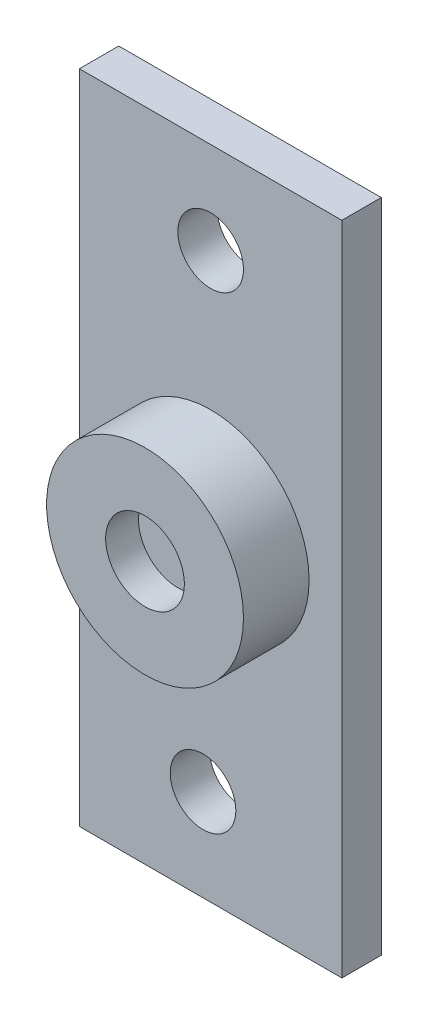
ISO-10303-21;
HEADER;
FILE_DESCRIPTION(('STEP AP214'),'2;1');
FILE_NAME('part.step','',(''),(''),'','','');
FILE_SCHEMA(('AUTOMOTIVE_DESIGN { 1 0 10303 214 1 1 1 1 }'));
ENDSEC;
DATA;
#1=APPLICATION_CONTEXT('core data for automotive mechanical design processes');
#2=APPLICATION_PROTOCOL_DEFINITION('international standard','automotive_design',2000,#1);
#3=PRODUCT_CONTEXT('',#1,'mechanical');
#4=PRODUCT('Part','Part','',(#3));
#5=PRODUCT_RELATED_PRODUCT_CATEGORY('part','',(#4));
#6=PRODUCT_DEFINITION_FORMATION('','',#4);
#7=PRODUCT_DEFINITION_CONTEXT('part definition',#1,'design');
#8=PRODUCT_DEFINITION('design','',#6,#7);
#9=PRODUCT_DEFINITION_SHAPE('','',#8);
#10=(LENGTH_UNIT() NAMED_UNIT(*) SI_UNIT(.MILLI.,.METRE.));
#11=(NAMED_UNIT(*) PLANE_ANGLE_UNIT() SI_UNIT($,.RADIAN.));
#12=(NAMED_UNIT(*) SI_UNIT($,.STERADIAN.) SOLID_ANGLE_UNIT());
#13=UNCERTAINTY_MEASURE_WITH_UNIT(LENGTH_MEASURE(1.E-05),#10,'distance_accuracy_value','');
#14=(GEOMETRIC_REPRESENTATION_CONTEXT(3) GLOBAL_UNCERTAINTY_ASSIGNED_CONTEXT((#13)) GLOBAL_UNIT_ASSIGNED_CONTEXT((#10,
#11,#12)) REPRESENTATION_CONTEXT('',''));
#15=CARTESIAN_POINT('',(0.,0.,0.));
#16=DIRECTION('',(0.,0.,1.));
#17=DIRECTION('',(1.,0.,0.));
#18=AXIS2_PLACEMENT_3D('',#15,#16,#17);
#19=CARTESIAN_POINT('',(-10.,-25.,3.));
#20=DIRECTION('',(1.,0.,0.));
#21=DIRECTION('',(0.,0.,-1.));
#22=AXIS2_PLACEMENT_3D('',#19,#20,#21);
#23=PLANE('',#22);
#24=DIRECTION('',(0.,-1.,0.));
#25=VECTOR('',#24,1.);
#26=CARTESIAN_POINT('',(-10.,-25.,0.));
#27=LINE('',#26,#25);
#28=CARTESIAN_POINT('',(-10.,25.,0.));
#29=VERTEX_POINT('',#28);
#30=CARTESIAN_POINT('',(-10.,-25.,0.));
#31=VERTEX_POINT('',#30);
#32=EDGE_CURVE('E114',#29,#31,#27,.T.);
#33=ORIENTED_EDGE('',*,*,#32,.T.);
#34=DIRECTION('',(0.,0.,-1.));
#35=VECTOR('',#34,1.);
#36=CARTESIAN_POINT('',(-10.,-25.,3.));
#37=LINE('',#36,#35);
#38=CARTESIAN_POINT('',(-10.,-25.,3.));
#39=VERTEX_POINT('',#38);
#40=EDGE_CURVE('E46',#39,#31,#37,.T.);
#41=ORIENTED_EDGE('',*,*,#40,.F.);
#42=DIRECTION('',(0.,-1.,0.));
#43=VECTOR('',#42,1.);
#44=CARTESIAN_POINT('',(-10.,-25.,3.));
#45=LINE('',#44,#43);
#46=CARTESIAN_POINT('',(-10.,25.,3.));
#47=VERTEX_POINT('',#46);
#48=EDGE_CURVE('E97',#47,#39,#45,.T.);
#49=ORIENTED_EDGE('',*,*,#48,.F.);
#50=DIRECTION('',(0.,0.,-1.));
#51=VECTOR('',#50,1.);
#52=CARTESIAN_POINT('',(-10.,25.,3.));
#53=LINE('',#52,#51);
#54=EDGE_CURVE('E110',#47,#29,#53,.T.);
#55=ORIENTED_EDGE('',*,*,#54,.T.);
#56=EDGE_LOOP('',(#33,#41,#49,#55));
#57=FACE_BOUND('',#56,.T.);
#58=ADVANCED_FACE('F43',(#57),#23,.F.);
#59=CARTESIAN_POINT('',(10.,-25.,3.));
#60=DIRECTION('',(0.,1.,0.));
#61=DIRECTION('',(0.,0.,1.));
#62=AXIS2_PLACEMENT_3D('',#59,#60,#61);
#63=PLANE('',#62);
#64=DIRECTION('',(1.,0.,0.));
#65=VECTOR('',#64,1.);
#66=CARTESIAN_POINT('',(10.,-25.,0.));
#67=LINE('',#66,#65);
#68=CARTESIAN_POINT('',(10.,-25.,0.));
#69=VERTEX_POINT('',#68);
#70=EDGE_CURVE('E103',#31,#69,#67,.T.);
#71=ORIENTED_EDGE('',*,*,#70,.T.);
#72=DIRECTION('',(0.,0.,-1.));
#73=VECTOR('',#72,1.);
#74=CARTESIAN_POINT('',(10.,-25.,3.));
#75=LINE('',#74,#73);
#76=CARTESIAN_POINT('',(10.,-25.,3.));
#77=VERTEX_POINT('',#76);
#78=EDGE_CURVE('E101',#77,#69,#75,.T.);
#79=ORIENTED_EDGE('',*,*,#78,.F.);
#80=DIRECTION('',(1.,0.,0.));
#81=VECTOR('',#80,1.);
#82=CARTESIAN_POINT('',(10.,-25.,3.));
#83=LINE('',#82,#81);
#84=EDGE_CURVE('E92',#39,#77,#83,.T.);
#85=ORIENTED_EDGE('',*,*,#84,.F.);
#86=ORIENTED_EDGE('',*,*,#40,.T.);
#87=EDGE_LOOP('',(#71,#79,#85,#86));
#88=FACE_BOUND('',#87,.T.);
#89=ADVANCED_FACE('F102',(#88),#63,.F.);
#90=CARTESIAN_POINT('',(10.,-25.,3.));
#91=DIRECTION('',(-1.,0.,0.));
#92=DIRECTION('',(0.,0.,1.));
#93=AXIS2_PLACEMENT_3D('',#90,#91,#92);
#94=PLANE('',#93);
#95=DIRECTION('',(0.,1.,0.));
#96=VECTOR('',#95,1.);
#97=CARTESIAN_POINT('',(10.,-25.,0.));
#98=LINE('',#97,#96);
#99=CARTESIAN_POINT('',(10.,25.,0.));
#100=VERTEX_POINT('',#99);
#101=EDGE_CURVE('E78',#69,#100,#98,.T.);
#102=ORIENTED_EDGE('',*,*,#101,.T.);
#103=DIRECTION('',(0.,0.,-1.));
#104=VECTOR('',#103,1.);
#105=CARTESIAN_POINT('',(10.,25.,3.));
#106=LINE('',#105,#104);
#107=CARTESIAN_POINT('',(10.,25.,3.));
#108=VERTEX_POINT('',#107);
#109=EDGE_CURVE('E105',#108,#100,#106,.T.);
#110=ORIENTED_EDGE('',*,*,#109,.F.);
#111=DIRECTION('',(0.,1.,0.));
#112=VECTOR('',#111,1.);
#113=CARTESIAN_POINT('',(10.,-25.,3.));
#114=LINE('',#113,#112);
#115=EDGE_CURVE('E95',#77,#108,#114,.T.);
#116=ORIENTED_EDGE('',*,*,#115,.F.);
#117=ORIENTED_EDGE('',*,*,#78,.T.);
#118=EDGE_LOOP('',(#102,#110,#116,#117));
#119=FACE_BOUND('',#118,.T.);
#120=ADVANCED_FACE('F106',(#119),#94,.F.);
#121=CARTESIAN_POINT('',(10.,25.,3.));
#122=DIRECTION('',(0.,-1.,0.));
#123=DIRECTION('',(0.,0.,-1.));
#124=AXIS2_PLACEMENT_3D('',#121,#122,#123);
#125=PLANE('',#124);
#126=DIRECTION('',(-1.,0.,0.));
#127=VECTOR('',#126,1.);
#128=CARTESIAN_POINT('',(10.,25.,0.));
#129=LINE('',#128,#127);
#130=EDGE_CURVE('E84',#100,#29,#129,.T.);
#131=ORIENTED_EDGE('',*,*,#130,.T.);
#132=ORIENTED_EDGE('',*,*,#54,.F.);
#133=DIRECTION('',(-1.,0.,0.));
#134=VECTOR('',#133,1.);
#135=CARTESIAN_POINT('',(10.,25.,3.));
#136=LINE('',#135,#134);
#137=EDGE_CURVE('E61',#108,#47,#136,.T.);
#138=ORIENTED_EDGE('',*,*,#137,.F.);
#139=ORIENTED_EDGE('',*,*,#109,.T.);
#140=EDGE_LOOP('',(#131,#132,#138,#139));
#141=FACE_BOUND('',#140,.T.);
#142=ADVANCED_FACE('F128',(#141),#125,.F.);
#143=CARTESIAN_POINT('',(0.,0.,3.));
#144=DIRECTION('',(0.,0.,1.));
#145=DIRECTION('',(1.,0.,0.));
#146=AXIS2_PLACEMENT_3D('',#143,#144,#145);
#147=PLANE('',#146);
#148=CARTESIAN_POINT('',(0.,18.,3.));
#149=DIRECTION('',(0.,0.,1.));
#150=DIRECTION('',(1.,0.,0.));
#151=AXIS2_PLACEMENT_3D('',#148,#149,#150);
#152=CIRCLE('',#151,2.5);
#153=CARTESIAN_POINT('',(2.5,18.,3.));
#154=VERTEX_POINT('',#153);
#155=EDGE_CURVE('E155',#154,#154,#152,.T.);
#156=ORIENTED_EDGE('',*,*,#155,.F.);
#157=EDGE_LOOP('',(#156));
#158=FACE_BOUND('',#157,.T.);
#159=CARTESIAN_POINT('',(-0.580661346620645,-18.,3.));
#160=DIRECTION('',(0.,0.,1.));
#161=DIRECTION('',(1.,0.,0.));
#162=AXIS2_PLACEMENT_3D('',#159,#160,#161);
#163=CIRCLE('',#162,2.5);
#164=CARTESIAN_POINT('',(1.91933865337936,-18.,3.));
#165=VERTEX_POINT('',#164);
#166=EDGE_CURVE('E151',#165,#165,#163,.T.);
#167=ORIENTED_EDGE('',*,*,#166,.F.);
#168=EDGE_LOOP('',(#167));
#169=FACE_BOUND('',#168,.T.);
#170=CARTESIAN_POINT('',(0.,0.,3.));
#171=DIRECTION('',(0.,0.,1.));
#172=DIRECTION('',(1.,0.,0.));
#173=AXIS2_PLACEMENT_3D('',#170,#171,#172);
#174=CIRCLE('',#173,7.5);
#175=CARTESIAN_POINT('',(7.5,0.,3.));
#176=VERTEX_POINT('',#175);
#177=EDGE_CURVE('E11',#176,#176,#174,.T.);
#178=ORIENTED_EDGE('',*,*,#177,.F.);
#179=EDGE_LOOP('',(#178));
#180=FACE_BOUND('',#179,.T.);
#181=ORIENTED_EDGE('',*,*,#48,.T.);
#182=ORIENTED_EDGE('',*,*,#84,.T.);
#183=ORIENTED_EDGE('',*,*,#115,.T.);
#184=ORIENTED_EDGE('',*,*,#137,.T.);
#185=EDGE_LOOP('',(#181,#182,#183,#184));
#186=FACE_BOUND('',#185,.T.);
#187=ADVANCED_FACE('F93',(#158,#169,#180,#186),#147,.T.);
#188=CARTESIAN_POINT('',(0.,0.,0.));
#189=DIRECTION('',(0.,0.,1.));
#190=DIRECTION('',(1.,0.,0.));
#191=AXIS2_PLACEMENT_3D('',#188,#189,#190);
#192=PLANE('',#191);
#193=CARTESIAN_POINT('',(0.,18.,0.));
#194=DIRECTION('',(0.,0.,1.));
#195=DIRECTION('',(1.,0.,0.));
#196=AXIS2_PLACEMENT_3D('',#193,#194,#195);
#197=CIRCLE('',#196,2.5);
#198=CARTESIAN_POINT('',(2.5,18.,0.));
#199=VERTEX_POINT('',#198);
#200=EDGE_CURVE('E143',#199,#199,#197,.T.);
#201=ORIENTED_EDGE('',*,*,#200,.T.);
#202=EDGE_LOOP('',(#201));
#203=FACE_BOUND('',#202,.T.);
#204=CARTESIAN_POINT('',(-0.580661346620645,-18.,0.));
#205=DIRECTION('',(0.,0.,1.));
#206=DIRECTION('',(1.,0.,0.));
#207=AXIS2_PLACEMENT_3D('',#204,#205,#206);
#208=CIRCLE('',#207,2.5);
#209=CARTESIAN_POINT('',(1.91933865337936,-18.,0.));
#210=VERTEX_POINT('',#209);
#211=EDGE_CURVE('E147',#210,#210,#208,.T.);
#212=ORIENTED_EDGE('',*,*,#211,.T.);
#213=EDGE_LOOP('',(#212));
#214=FACE_BOUND('',#213,.T.);
#215=ORIENTED_EDGE('',*,*,#32,.F.);
#216=ORIENTED_EDGE('',*,*,#130,.F.);
#217=ORIENTED_EDGE('',*,*,#101,.F.);
#218=ORIENTED_EDGE('',*,*,#70,.F.);
#219=EDGE_LOOP('',(#215,#216,#217,#218));
#220=FACE_BOUND('',#219,.T.);
#221=ADVANCED_FACE('F131',(#203,#214,#220),#192,.F.);
#222=CARTESIAN_POINT('',(0.,0.,8.));
#223=DIRECTION('',(0.,0.,-1.));
#224=DIRECTION('',(-1.,0.,0.));
#225=AXIS2_PLACEMENT_3D('',#222,#223,#224);
#226=CYLINDRICAL_SURFACE('',#225,7.5);
#227=CARTESIAN_POINT('',(0.,0.,8.));
#228=DIRECTION('',(0.,0.,1.));
#229=DIRECTION('',(1.,0.,0.));
#230=AXIS2_PLACEMENT_3D('',#227,#228,#229);
#231=CIRCLE('',#230,7.5);
#232=CARTESIAN_POINT('',(7.5,0.,8.));
#233=VERTEX_POINT('',#232);
#234=EDGE_CURVE('E118',#233,#233,#231,.T.);
#235=ORIENTED_EDGE('',*,*,#234,.F.);
#236=EDGE_LOOP('',(#235));
#237=FACE_BOUND('',#236,.T.);
#238=ORIENTED_EDGE('',*,*,#177,.T.);
#239=EDGE_LOOP('',(#238));
#240=FACE_BOUND('',#239,.T.);
#241=ADVANCED_FACE('F179',(#237,#240),#226,.T.);
#242=CARTESIAN_POINT('',(0.,0.,8.));
#243=DIRECTION('',(0.,0.,1.));
#244=DIRECTION('',(1.,0.,0.));
#245=AXIS2_PLACEMENT_3D('',#242,#243,#244);
#246=PLANE('',#245);
#247=CARTESIAN_POINT('',(0.,0.,8.));
#248=DIRECTION('',(0.,0.,1.));
#249=DIRECTION('',(1.,0.,0.));
#250=AXIS2_PLACEMENT_3D('',#247,#248,#249);
#251=CIRCLE('',#250,3.);
#252=CARTESIAN_POINT('',(3.,0.,8.));
#253=VERTEX_POINT('',#252);
#254=EDGE_CURVE('E139',#253,#253,#251,.T.);
#255=ORIENTED_EDGE('',*,*,#254,.F.);
#256=EDGE_LOOP('',(#255));
#257=FACE_BOUND('',#256,.T.);
#258=ORIENTED_EDGE('',*,*,#234,.T.);
#259=EDGE_LOOP('',(#258));
#260=FACE_BOUND('',#259,.T.);
#261=ADVANCED_FACE('F181',(#257,#260),#246,.T.);
#262=CARTESIAN_POINT('',(0.,0.,5.5));
#263=DIRECTION('',(0.,0.,1.));
#264=DIRECTION('',(1.,0.,0.));
#265=AXIS2_PLACEMENT_3D('',#262,#263,#264);
#266=CYLINDRICAL_SURFACE('',#265,3.);
#267=CARTESIAN_POINT('',(0.,0.,5.5));
#268=DIRECTION('',(0.,0.,1.));
#269=DIRECTION('',(1.,0.,0.));
#270=AXIS2_PLACEMENT_3D('',#267,#268,#269);
#271=CIRCLE('',#270,3.);
#272=CARTESIAN_POINT('',(3.,0.,5.5));
#273=VERTEX_POINT('',#272);
#274=EDGE_CURVE('E138',#273,#273,#271,.T.);
#275=ORIENTED_EDGE('',*,*,#274,.F.);
#276=EDGE_LOOP('',(#275));
#277=FACE_BOUND('',#276,.T.);
#278=ORIENTED_EDGE('',*,*,#254,.T.);
#279=EDGE_LOOP('',(#278));
#280=FACE_BOUND('',#279,.T.);
#281=ADVANCED_FACE('F188',(#277,#280),#266,.F.);
#282=CARTESIAN_POINT('',(0.,0.,5.5));
#283=DIRECTION('',(0.,0.,1.));
#284=DIRECTION('',(1.,0.,0.));
#285=AXIS2_PLACEMENT_3D('',#282,#283,#284);
#286=PLANE('',#285);
#287=ORIENTED_EDGE('',*,*,#274,.T.);
#288=EDGE_LOOP('',(#287));
#289=FACE_BOUND('',#288,.T.);
#290=ADVANCED_FACE('F227',(#289),#286,.T.);
#291=CARTESIAN_POINT('',(-0.580661346620645,-18.,0.));
#292=DIRECTION('',(0.,0.,1.));
#293=DIRECTION('',(1.,0.,0.));
#294=AXIS2_PLACEMENT_3D('',#291,#292,#293);
#295=CYLINDRICAL_SURFACE('',#294,2.5);
#296=ORIENTED_EDGE('',*,*,#211,.F.);
#297=EDGE_LOOP('',(#296));
#298=FACE_BOUND('',#297,.T.);
#299=ORIENTED_EDGE('',*,*,#166,.T.);
#300=EDGE_LOOP('',(#299));
#301=FACE_BOUND('',#300,.T.);
#302=ADVANCED_FACE('F168',(#298,#301),#295,.F.);
#303=CARTESIAN_POINT('',(0.,18.,0.));
#304=DIRECTION('',(0.,0.,1.));
#305=DIRECTION('',(1.,0.,0.));
#306=AXIS2_PLACEMENT_3D('',#303,#304,#305);
#307=CYLINDRICAL_SURFACE('',#306,2.5);
#308=ORIENTED_EDGE('',*,*,#200,.F.);
#309=EDGE_LOOP('',(#308));
#310=FACE_BOUND('',#309,.T.);
#311=ORIENTED_EDGE('',*,*,#155,.T.);
#312=EDGE_LOOP('',(#311));
#313=FACE_BOUND('',#312,.T.);
#314=ADVANCED_FACE('F165',(#310,#313),#307,.F.);
#315=CLOSED_SHELL('',(#58,#89,#120,#142,#187,#221,#241,#261,#281,#290,#302,#314));
#316=MANIFOLD_SOLID_BREP('B2',#315);
#317=ADVANCED_BREP_SHAPE_REPRESENTATION('',(#18,#316),#14);
#318=SHAPE_DEFINITION_REPRESENTATION(#9,#317);
ENDSEC;
END-ISO-10303-21;
